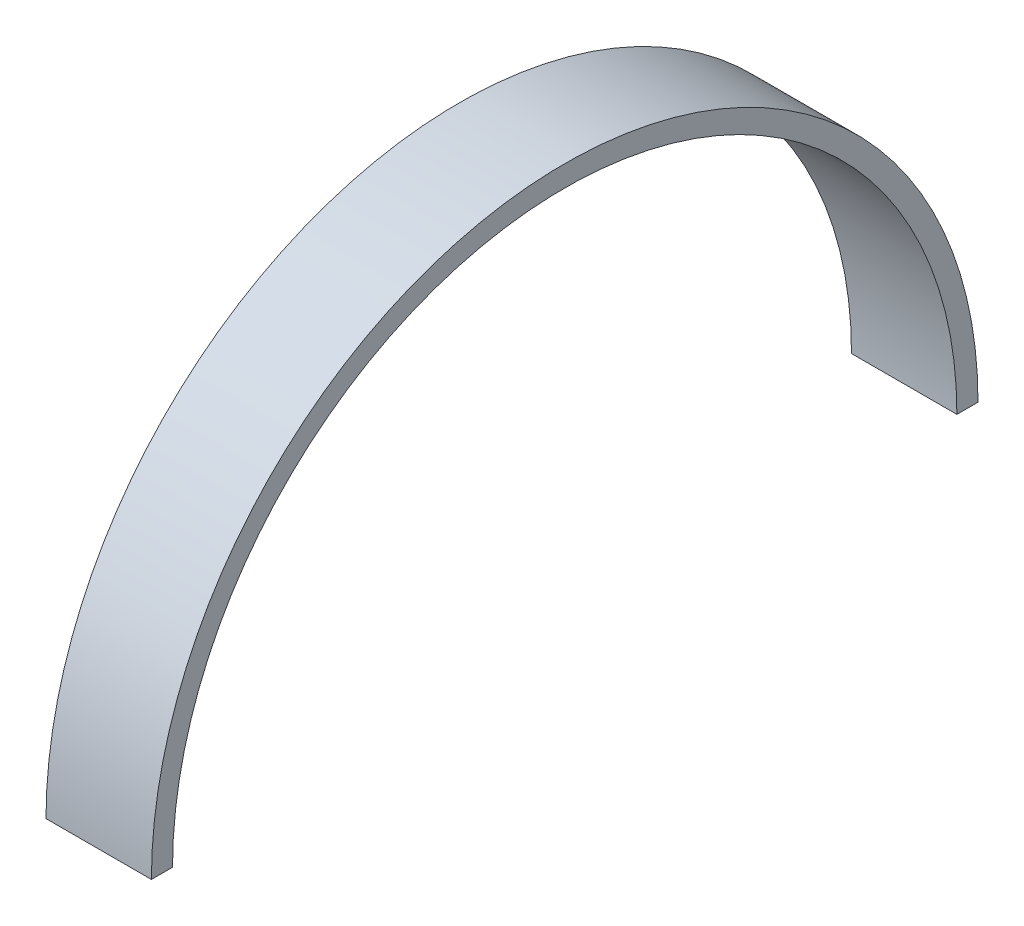
ISO-10303-21;
HEADER;
FILE_DESCRIPTION(('STEP AP214'),'2;1');
FILE_NAME('part.step','',(''),(''),'','','');
FILE_SCHEMA(('AUTOMOTIVE_DESIGN { 1 0 10303 214 1 1 1 1 }'));
ENDSEC;
DATA;
#1=APPLICATION_CONTEXT('core data for automotive mechanical design processes');
#2=APPLICATION_PROTOCOL_DEFINITION('international standard','automotive_design',2000,#1);
#3=PRODUCT_CONTEXT('',#1,'mechanical');
#4=PRODUCT('Part','Part','',(#3));
#5=PRODUCT_RELATED_PRODUCT_CATEGORY('part','',(#4));
#6=PRODUCT_DEFINITION_FORMATION('','',#4);
#7=PRODUCT_DEFINITION_CONTEXT('part definition',#1,'design');
#8=PRODUCT_DEFINITION('design','',#6,#7);
#9=PRODUCT_DEFINITION_SHAPE('','',#8);
#10=(LENGTH_UNIT() NAMED_UNIT(*) SI_UNIT(.MILLI.,.METRE.));
#11=(NAMED_UNIT(*) PLANE_ANGLE_UNIT() SI_UNIT($,.RADIAN.));
#12=(NAMED_UNIT(*) SI_UNIT($,.STERADIAN.) SOLID_ANGLE_UNIT());
#13=UNCERTAINTY_MEASURE_WITH_UNIT(LENGTH_MEASURE(1.E-05),#10,'distance_accuracy_value','');
#14=(GEOMETRIC_REPRESENTATION_CONTEXT(3) GLOBAL_UNCERTAINTY_ASSIGNED_CONTEXT((#13)) GLOBAL_UNIT_ASSIGNED_CONTEXT((#10,
#11,#12)) REPRESENTATION_CONTEXT('',''));
#15=CARTESIAN_POINT('',(0.,0.,0.));
#16=DIRECTION('',(0.,0.,1.));
#17=DIRECTION('',(1.,0.,0.));
#18=AXIS2_PLACEMENT_3D('',#15,#16,#17);
#19=CARTESIAN_POINT('',(10.,0.,0.));
#20=DIRECTION('',(-1.,0.,0.));
#21=DIRECTION('',(0.,0.,1.));
#22=AXIS2_PLACEMENT_3D('',#19,#20,#21);
#23=CYLINDRICAL_SURFACE('',#22,39.2138868170855);
#24=CARTESIAN_POINT('',(0.,0.,0.));
#25=DIRECTION('',(1.,0.,0.));
#26=DIRECTION('',(0.,0.,-1.));
#27=AXIS2_PLACEMENT_3D('',#24,#25,#26);
#28=CIRCLE('',#27,39.2138868170855);
#29=CARTESIAN_POINT('',(0.,0.,-39.2138868170855));
#30=VERTEX_POINT('',#29);
#31=CARTESIAN_POINT('',(0.,0.,39.2138868170855));
#32=VERTEX_POINT('',#31);
#33=EDGE_CURVE('E98',#30,#32,#28,.T.);
#34=ORIENTED_EDGE('',*,*,#33,.T.);
#35=DIRECTION('',(-1.,0.,0.));
#36=VECTOR('',#35,1.);
#37=CARTESIAN_POINT('',(10.,0.,39.2138868170855));
#38=LINE('',#37,#36);
#39=CARTESIAN_POINT('',(10.,0.,39.2138868170855));
#40=VERTEX_POINT('',#39);
#41=EDGE_CURVE('E11',#40,#32,#38,.T.);
#42=ORIENTED_EDGE('',*,*,#41,.F.);
#43=CARTESIAN_POINT('',(10.,0.,0.));
#44=DIRECTION('',(1.,0.,0.));
#45=DIRECTION('',(0.,0.,-1.));
#46=AXIS2_PLACEMENT_3D('',#43,#44,#45);
#47=CIRCLE('',#46,39.2138868170855);
#48=CARTESIAN_POINT('',(10.,0.,-39.2138868170855));
#49=VERTEX_POINT('',#48);
#50=EDGE_CURVE('E86',#49,#40,#47,.T.);
#51=ORIENTED_EDGE('',*,*,#50,.F.);
#52=DIRECTION('',(-1.,0.,0.));
#53=VECTOR('',#52,1.);
#54=CARTESIAN_POINT('',(10.,0.,-39.2138868170855));
#55=LINE('',#54,#53);
#56=EDGE_CURVE('E94',#49,#30,#55,.T.);
#57=ORIENTED_EDGE('',*,*,#56,.T.);
#58=EDGE_LOOP('',(#34,#42,#51,#57));
#59=FACE_BOUND('',#58,.T.);
#60=ADVANCED_FACE('F35',(#59),#23,.T.);
#61=CARTESIAN_POINT('',(10.,0.,37.211475575362));
#62=DIRECTION('',(0.,1.,0.));
#63=DIRECTION('',(0.,0.,1.));
#64=AXIS2_PLACEMENT_3D('',#61,#62,#63);
#65=PLANE('',#64);
#66=DIRECTION('',(0.,0.,-1.));
#67=VECTOR('',#66,1.);
#68=CARTESIAN_POINT('',(0.,0.,37.211475575362));
#69=LINE('',#68,#67);
#70=CARTESIAN_POINT('',(0.,0.,37.211475575362));
#71=VERTEX_POINT('',#70);
#72=EDGE_CURVE('E90',#32,#71,#69,.T.);
#73=ORIENTED_EDGE('',*,*,#72,.T.);
#74=DIRECTION('',(-1.,0.,0.));
#75=VECTOR('',#74,1.);
#76=CARTESIAN_POINT('',(10.,0.,37.211475575362));
#77=LINE('',#76,#75);
#78=CARTESIAN_POINT('',(10.,0.,37.211475575362));
#79=VERTEX_POINT('',#78);
#80=EDGE_CURVE('E43',#79,#71,#77,.T.);
#81=ORIENTED_EDGE('',*,*,#80,.F.);
#82=DIRECTION('',(0.,0.,-1.));
#83=VECTOR('',#82,1.);
#84=CARTESIAN_POINT('',(10.,0.,37.211475575362));
#85=LINE('',#84,#83);
#86=EDGE_CURVE('E81',#40,#79,#85,.T.);
#87=ORIENTED_EDGE('',*,*,#86,.F.);
#88=ORIENTED_EDGE('',*,*,#41,.T.);
#89=EDGE_LOOP('',(#73,#81,#87,#88));
#90=FACE_BOUND('',#89,.T.);
#91=ADVANCED_FACE('F89',(#90),#65,.F.);
#92=CARTESIAN_POINT('',(10.,0.,0.));
#93=DIRECTION('',(-1.,0.,0.));
#94=DIRECTION('',(0.,0.,1.));
#95=AXIS2_PLACEMENT_3D('',#92,#93,#94);
#96=CYLINDRICAL_SURFACE('',#95,37.211475575362);
#97=CARTESIAN_POINT('',(0.,0.,0.));
#98=DIRECTION('',(-1.,0.,0.));
#99=DIRECTION('',(0.,0.,-1.));
#100=AXIS2_PLACEMENT_3D('',#97,#98,#99);
#101=CIRCLE('',#100,37.211475575362);
#102=CARTESIAN_POINT('',(0.,0.,-37.211475575362));
#103=VERTEX_POINT('',#102);
#104=EDGE_CURVE('E68',#71,#103,#101,.T.);
#105=ORIENTED_EDGE('',*,*,#104,.T.);
#106=DIRECTION('',(-1.,0.,0.));
#107=VECTOR('',#106,1.);
#108=CARTESIAN_POINT('',(10.,0.,-37.211475575362));
#109=LINE('',#108,#107);
#110=CARTESIAN_POINT('',(10.,0.,-37.211475575362));
#111=VERTEX_POINT('',#110);
#112=EDGE_CURVE('E91',#111,#103,#109,.T.);
#113=ORIENTED_EDGE('',*,*,#112,.F.);
#114=CARTESIAN_POINT('',(10.,0.,0.));
#115=DIRECTION('',(-1.,0.,0.));
#116=DIRECTION('',(0.,0.,-1.));
#117=AXIS2_PLACEMENT_3D('',#114,#115,#116);
#118=CIRCLE('',#117,37.211475575362);
#119=EDGE_CURVE('E84',#79,#111,#118,.T.);
#120=ORIENTED_EDGE('',*,*,#119,.F.);
#121=ORIENTED_EDGE('',*,*,#80,.T.);
#122=EDGE_LOOP('',(#105,#113,#120,#121));
#123=FACE_BOUND('',#122,.T.);
#124=ADVANCED_FACE('F92',(#123),#96,.F.);
#125=CARTESIAN_POINT('',(10.,0.,-39.2138868170855));
#126=DIRECTION('',(0.,1.,0.));
#127=DIRECTION('',(0.,0.,1.));
#128=AXIS2_PLACEMENT_3D('',#125,#126,#127);
#129=PLANE('',#128);
#130=DIRECTION('',(0.,0.,-1.));
#131=VECTOR('',#130,1.);
#132=CARTESIAN_POINT('',(0.,0.,-39.2138868170855));
#133=LINE('',#132,#131);
#134=EDGE_CURVE('E74',#103,#30,#133,.T.);
#135=ORIENTED_EDGE('',*,*,#134,.T.);
#136=ORIENTED_EDGE('',*,*,#56,.F.);
#137=DIRECTION('',(0.,0.,-1.));
#138=VECTOR('',#137,1.);
#139=CARTESIAN_POINT('',(10.,0.,-39.2138868170855));
#140=LINE('',#139,#138);
#141=EDGE_CURVE('E51',#111,#49,#140,.T.);
#142=ORIENTED_EDGE('',*,*,#141,.F.);
#143=ORIENTED_EDGE('',*,*,#112,.T.);
#144=EDGE_LOOP('',(#135,#136,#142,#143));
#145=FACE_BOUND('',#144,.T.);
#146=ADVANCED_FACE('F105',(#145),#129,.F.);
#147=CARTESIAN_POINT('',(10.,0.,0.));
#148=DIRECTION('',(1.,0.,0.));
#149=DIRECTION('',(0.,0.,-1.));
#150=AXIS2_PLACEMENT_3D('',#147,#148,#149);
#151=PLANE('',#150);
#152=ORIENTED_EDGE('',*,*,#50,.T.);
#153=ORIENTED_EDGE('',*,*,#86,.T.);
#154=ORIENTED_EDGE('',*,*,#119,.T.);
#155=ORIENTED_EDGE('',*,*,#141,.T.);
#156=EDGE_LOOP('',(#152,#153,#154,#155));
#157=FACE_BOUND('',#156,.T.);
#158=ADVANCED_FACE('F82',(#157),#151,.T.);
#159=CARTESIAN_POINT('',(0.,0.,0.));
#160=DIRECTION('',(1.,0.,0.));
#161=DIRECTION('',(0.,0.,-1.));
#162=AXIS2_PLACEMENT_3D('',#159,#160,#161);
#163=PLANE('',#162);
#164=ORIENTED_EDGE('',*,*,#33,.F.);
#165=ORIENTED_EDGE('',*,*,#134,.F.);
#166=ORIENTED_EDGE('',*,*,#104,.F.);
#167=ORIENTED_EDGE('',*,*,#72,.F.);
#168=EDGE_LOOP('',(#164,#165,#166,#167));
#169=FACE_BOUND('',#168,.T.);
#170=ADVANCED_FACE('F108',(#169),#163,.F.);
#171=CLOSED_SHELL('',(#60,#91,#124,#146,#158,#170));
#172=MANIFOLD_SOLID_BREP('B2',#171);
#173=ADVANCED_BREP_SHAPE_REPRESENTATION('',(#18,#172),#14);
#174=SHAPE_DEFINITION_REPRESENTATION(#9,#173);
ENDSEC;
END-ISO-10303-21;
